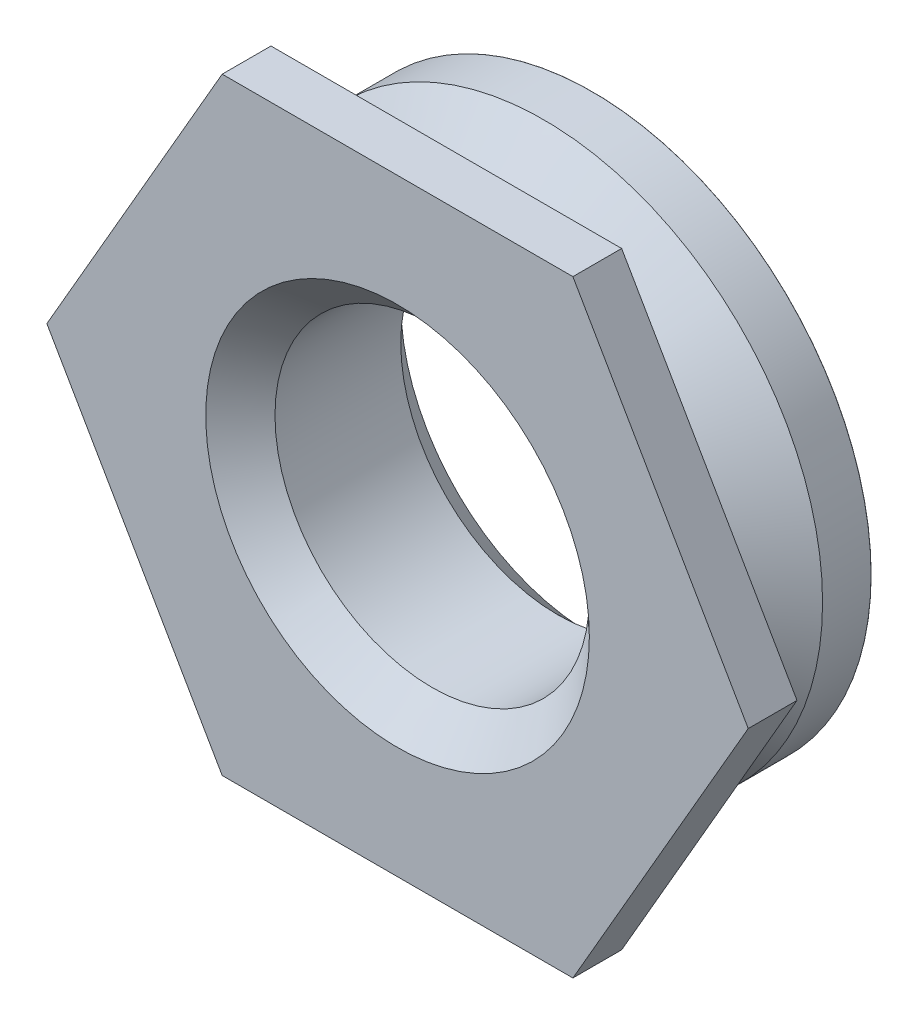
ISO-10303-21;
HEADER;
FILE_DESCRIPTION(('STEP AP214'),'2;1');
FILE_NAME('part.step','',(''),(''),'','','');
FILE_SCHEMA(('AUTOMOTIVE_DESIGN { 1 0 10303 214 1 1 1 1 }'));
ENDSEC;
DATA;
#1=APPLICATION_CONTEXT('core data for automotive mechanical design processes');
#2=APPLICATION_PROTOCOL_DEFINITION('international standard','automotive_design',2000,#1);
#3=PRODUCT_CONTEXT('',#1,'mechanical');
#4=PRODUCT('Part','Part','',(#3));
#5=PRODUCT_RELATED_PRODUCT_CATEGORY('part','',(#4));
#6=PRODUCT_DEFINITION_FORMATION('','',#4);
#7=PRODUCT_DEFINITION_CONTEXT('part definition',#1,'design');
#8=PRODUCT_DEFINITION('design','',#6,#7);
#9=PRODUCT_DEFINITION_SHAPE('','',#8);
#10=(LENGTH_UNIT() NAMED_UNIT(*) SI_UNIT(.MILLI.,.METRE.));
#11=(NAMED_UNIT(*) PLANE_ANGLE_UNIT() SI_UNIT($,.RADIAN.));
#12=(NAMED_UNIT(*) SI_UNIT($,.STERADIAN.) SOLID_ANGLE_UNIT());
#13=UNCERTAINTY_MEASURE_WITH_UNIT(LENGTH_MEASURE(1.E-05),#10,'distance_accuracy_value','');
#14=(GEOMETRIC_REPRESENTATION_CONTEXT(3) GLOBAL_UNCERTAINTY_ASSIGNED_CONTEXT((#13)) GLOBAL_UNIT_ASSIGNED_CONTEXT((#10,
#11,#12)) REPRESENTATION_CONTEXT('',''));
#15=CARTESIAN_POINT('',(0.,0.,0.));
#16=DIRECTION('',(0.,0.,1.));
#17=DIRECTION('',(1.,0.,0.));
#18=AXIS2_PLACEMENT_3D('',#15,#16,#17);
#19=CARTESIAN_POINT('',(0.,0.,0.38375));
#20=DIRECTION('',(0.,0.,-1.));
#21=DIRECTION('',(-1.,0.,0.));
#22=AXIS2_PLACEMENT_3D('',#19,#20,#21);
#23=CYLINDRICAL_SURFACE('',#22,4.36);
#24=CARTESIAN_POINT('',(0.,0.,0.00499999999999923));
#25=DIRECTION('',(0.,0.,-1.));
#26=DIRECTION('',(-1.,0.,0.));
#27=AXIS2_PLACEMENT_3D('',#24,#25,#26);
#28=CIRCLE('',#27,4.36);
#29=CARTESIAN_POINT('',(-4.36,0.,0.00499999999999816));
#30=VERTEX_POINT('',#29);
#31=EDGE_CURVE('E137',#30,#30,#28,.T.);
#32=ORIENTED_EDGE('',*,*,#31,.F.);
#33=EDGE_LOOP('',(#32));
#34=FACE_BOUND('',#33,.T.);
#35=CARTESIAN_POINT('',(0.,0.,0.762500000007548));
#36=DIRECTION('',(0.,0.,-1.));
#37=DIRECTION('',(1.,0.,0.));
#38=AXIS2_PLACEMENT_3D('',#35,#36,#37);
#39=CIRCLE('',#38,4.35999999996284);
#40=CARTESIAN_POINT('',(4.35999999996284,0.,0.762500000007549));
#41=VERTEX_POINT('',#40);
#42=EDGE_CURVE('E90',#41,#41,#39,.F.);
#43=ORIENTED_EDGE('',*,*,#42,.F.);
#44=EDGE_LOOP('',(#43));
#45=FACE_BOUND('',#44,.T.);
#46=ADVANCED_FACE('F16',(#34,#45),#23,.T.);
#47=CARTESIAN_POINT('',(0.,0.,0.00499999999999923));
#48=DIRECTION('',(0.,0.,-1.));
#49=DIRECTION('',(-1.,0.,0.));
#50=AXIS2_PLACEMENT_3D('',#47,#48,#49);
#51=TOROIDAL_SURFACE('',#50,4.355,0.00499999999999923);
#52=CARTESIAN_POINT('',(0.,0.,0.));
#53=DIRECTION('',(0.,0.,1.));
#54=DIRECTION('',(-1.,0.,0.));
#55=AXIS2_PLACEMENT_3D('',#52,#53,#54);
#56=CIRCLE('',#55,4.355);
#57=CARTESIAN_POINT('',(4.355,0.,0.));
#58=VERTEX_POINT('',#57);
#59=CARTESIAN_POINT('',(-4.355,0.,0.));
#60=VERTEX_POINT('',#59);
#61=EDGE_CURVE('E84',#58,#60,#56,.F.);
#62=ORIENTED_EDGE('',*,*,#61,.F.);
#63=CARTESIAN_POINT('',(0.,0.,0.));
#64=DIRECTION('',(0.,0.,1.));
#65=DIRECTION('',(1.,0.,0.));
#66=AXIS2_PLACEMENT_3D('',#63,#64,#65);
#67=CIRCLE('',#66,4.355);
#68=EDGE_CURVE('E81',#60,#58,#67,.F.);
#69=ORIENTED_EDGE('',*,*,#68,.F.);
#70=EDGE_LOOP('',(#62,#69));
#71=FACE_BOUND('',#70,.T.);
#72=ORIENTED_EDGE('',*,*,#31,.T.);
#73=EDGE_LOOP('',(#72));
#74=FACE_BOUND('',#73,.T.);
#75=ADVANCED_FACE('F85',(#71,#74),#51,.T.);
#76=CARTESIAN_POINT('',(0.,0.,0.762499999950704));
#77=DIRECTION('',(0.,0.,-1.));
#78=DIRECTION('',(-1.,0.,0.));
#79=AXIS2_PLACEMENT_3D('',#76,#77,#78);
#80=CONICAL_SURFACE('',#79,4.36000000007652,0.852291173873955);
#81=CARTESIAN_POINT('',(0.,0.,1.525));
#82=DIRECTION('',(0.,0.,-1.));
#83=DIRECTION('',(-1.,0.,0.));
#84=AXIS2_PLACEMENT_3D('',#81,#82,#83);
#85=CIRCLE('',#84,3.488);
#86=CARTESIAN_POINT('',(-3.488,0.,1.525));
#87=VERTEX_POINT('',#86);
#88=EDGE_CURVE('E96',#87,#87,#85,.F.);
#89=ORIENTED_EDGE('',*,*,#88,.F.);
#90=EDGE_LOOP('',(#89));
#91=FACE_BOUND('',#90,.T.);
#92=ORIENTED_EDGE('',*,*,#42,.T.);
#93=EDGE_LOOP('',(#92));
#94=FACE_BOUND('',#93,.T.);
#95=ADVANCED_FACE('F116',(#91,#94),#80,.T.);
#96=CARTESIAN_POINT('',(2.1775,0.,0.));
#97=DIRECTION('',(0.,0.,-1.));
#98=DIRECTION('',(-1.,0.,0.));
#99=AXIS2_PLACEMENT_3D('',#96,#97,#98);
#100=PLANE('',#99);
#101=ORIENTED_EDGE('',*,*,#61,.T.);
#102=ORIENTED_EDGE('',*,*,#68,.T.);
#103=EDGE_LOOP('',(#101,#102));
#104=FACE_BOUND('',#103,.T.);
#105=CARTESIAN_POINT('',(0.,0.,0.));
#106=DIRECTION('',(0.,0.,-1.));
#107=DIRECTION('',(-1.,0.,0.));
#108=AXIS2_PLACEMENT_3D('',#105,#106,#107);
#109=CIRCLE('',#108,3.00000000004275);
#110=CARTESIAN_POINT('',(-3.00000000004275,0.,0.));
#111=VERTEX_POINT('',#110);
#112=EDGE_CURVE('E146',#111,#111,#109,.F.);
#113=ORIENTED_EDGE('',*,*,#112,.T.);
#114=EDGE_LOOP('',(#113));
#115=FACE_BOUND('',#114,.T.);
#116=ADVANCED_FACE('F93',(#104,#115),#100,.T.);
#117=CARTESIAN_POINT('',(0.,0.,1.90375));
#118=DIRECTION('',(0.,0.,-1.));
#119=DIRECTION('',(-1.,0.,0.));
#120=AXIS2_PLACEMENT_3D('',#117,#118,#119);
#121=CYLINDRICAL_SURFACE('',#120,3.488);
#122=ORIENTED_EDGE('',*,*,#88,.T.);
#123=EDGE_LOOP('',(#122));
#124=FACE_BOUND('',#123,.T.);
#125=CARTESIAN_POINT('',(0.,0.,2.2825));
#126=DIRECTION('',(0.,0.,-1.));
#127=DIRECTION('',(-1.,0.,0.));
#128=AXIS2_PLACEMENT_3D('',#125,#126,#127);
#129=CIRCLE('',#128,3.488);
#130=CARTESIAN_POINT('',(-3.488,0.,2.2825));
#131=VERTEX_POINT('',#130);
#132=EDGE_CURVE('E150',#131,#131,#129,.T.);
#133=ORIENTED_EDGE('',*,*,#132,.T.);
#134=EDGE_LOOP('',(#133));
#135=FACE_BOUND('',#134,.T.);
#136=ADVANCED_FACE('F115',(#124,#135),#121,.T.);
#137=CARTESIAN_POINT('',(0.,0.,5.68441536246203E-11));
#138=DIRECTION('',(0.,0.,-1.));
#139=DIRECTION('',(-1.,0.,0.));
#140=AXIS2_PLACEMENT_3D('',#137,#138,#139);
#141=CONICAL_SURFACE('',#140,2.9999999999859,0.785398163397448);
#142=ORIENTED_EDGE('',*,*,#112,.F.);
#143=EDGE_LOOP('',(#142));
#144=FACE_BOUND('',#143,.T.);
#145=CARTESIAN_POINT('',(0.,0.,0.541500000000001));
#146=DIRECTION('',(0.,0.,-1.));
#147=DIRECTION('',(-1.,0.,0.));
#148=AXIS2_PLACEMENT_3D('',#145,#146,#147);
#149=CIRCLE('',#148,2.4585);
#150=CARTESIAN_POINT('',(-2.4585,0.,0.541500000000001));
#151=VERTEX_POINT('',#150);
#152=EDGE_CURVE('E182',#151,#151,#149,.F.);
#153=ORIENTED_EDGE('',*,*,#152,.T.);
#154=EDGE_LOOP('',(#153));
#155=FACE_BOUND('',#154,.T.);
#156=ADVANCED_FACE('F169',(#144,#155),#141,.F.);
#157=CARTESIAN_POINT('',(0.,0.,2.2825));
#158=DIRECTION('',(0.,0.,-1.));
#159=DIRECTION('',(-1.,0.,0.));
#160=AXIS2_PLACEMENT_3D('',#157,#158,#159);
#161=TOROIDAL_SURFACE('',#160,3.493,0.00499999999999989);
#162=CARTESIAN_POINT('',(0.,0.,2.2875));
#163=DIRECTION('',(0.,0.,-1.));
#164=DIRECTION('',(-1.,0.,0.));
#165=AXIS2_PLACEMENT_3D('',#162,#163,#164);
#166=CIRCLE('',#165,3.493);
#167=CARTESIAN_POINT('',(3.493,0.,2.2875));
#168=VERTEX_POINT('',#167);
#169=CARTESIAN_POINT('',(-3.493,0.,2.2875));
#170=VERTEX_POINT('',#169);
#171=EDGE_CURVE('E178',#168,#170,#166,.F.);
#172=ORIENTED_EDGE('',*,*,#171,.F.);
#173=CARTESIAN_POINT('',(0.,0.,2.2875));
#174=DIRECTION('',(0.,0.,-1.));
#175=DIRECTION('',(1.,0.,0.));
#176=AXIS2_PLACEMENT_3D('',#173,#174,#175);
#177=CIRCLE('',#176,3.493);
#178=EDGE_CURVE('E153',#170,#168,#177,.F.);
#179=ORIENTED_EDGE('',*,*,#178,.F.);
#180=EDGE_LOOP('',(#172,#179));
#181=FACE_BOUND('',#180,.T.);
#182=ORIENTED_EDGE('',*,*,#132,.F.);
#183=EDGE_LOOP('',(#182));
#184=FACE_BOUND('',#183,.T.);
#185=ADVANCED_FACE('F158',(#181,#184),#161,.F.);
#186=CARTESIAN_POINT('',(0.,0.,1.525));
#187=DIRECTION('',(0.,0.,-1.));
#188=DIRECTION('',(-1.,0.,0.));
#189=AXIS2_PLACEMENT_3D('',#186,#187,#188);
#190=CYLINDRICAL_SURFACE('',#189,2.4585);
#191=ORIENTED_EDGE('',*,*,#152,.F.);
#192=EDGE_LOOP('',(#191));
#193=FACE_BOUND('',#192,.T.);
#194=CARTESIAN_POINT('',(0.,0.,2.50850000003311));
#195=DIRECTION('',(0.,0.,1.));
#196=DIRECTION('',(-1.,0.,0.));
#197=AXIS2_PLACEMENT_3D('',#194,#195,#196);
#198=CIRCLE('',#197,2.45850000004566);
#199=CARTESIAN_POINT('',(-2.45850000004566,0.,2.50850000003311));
#200=VERTEX_POINT('',#199);
#201=EDGE_CURVE('E176',#200,#200,#198,.T.);
#202=ORIENTED_EDGE('',*,*,#201,.T.);
#203=EDGE_LOOP('',(#202));
#204=FACE_BOUND('',#203,.T.);
#205=ADVANCED_FACE('F168',(#193,#204),#190,.F.);
#206=CARTESIAN_POINT('',(0.,0.,2.2875));
#207=DIRECTION('',(0.,0.,-1.));
#208=DIRECTION('',(-1.,0.,0.));
#209=AXIS2_PLACEMENT_3D('',#206,#207,#208);
#210=PLANE('',#209);
#211=ORIENTED_EDGE('',*,*,#178,.T.);
#212=ORIENTED_EDGE('',*,*,#171,.T.);
#213=EDGE_LOOP('',(#211,#212));
#214=FACE_BOUND('',#213,.T.);
#215=DIRECTION('',(0.5,-0.866025403784438,0.));
#216=VECTOR('',#215,1.);
#217=CARTESIAN_POINT('',(-5.48482755730145,0.,2.2875));
#218=LINE('',#217,#216);
#219=CARTESIAN_POINT('',(-5.48482755730145,0.,2.2875));
#220=VERTEX_POINT('',#219);
#221=CARTESIAN_POINT('',(-2.74241377865073,-4.75,2.2875));
#222=VERTEX_POINT('',#221);
#223=EDGE_CURVE('E282',#220,#222,#218,.T.);
#224=ORIENTED_EDGE('',*,*,#223,.F.);
#225=DIRECTION('',(-0.5,-0.866025403784439,0.));
#226=VECTOR('',#225,1.);
#227=CARTESIAN_POINT('',(-2.74241377865073,4.75,2.2875));
#228=LINE('',#227,#226);
#229=CARTESIAN_POINT('',(-2.74241377865073,4.75,2.2875));
#230=VERTEX_POINT('',#229);
#231=EDGE_CURVE('E283',#230,#220,#228,.T.);
#232=ORIENTED_EDGE('',*,*,#231,.F.);
#233=DIRECTION('',(-1.,0.,0.));
#234=VECTOR('',#233,1.);
#235=CARTESIAN_POINT('',(0.,4.75,2.2875));
#236=LINE('',#235,#234);
#237=CARTESIAN_POINT('',(2.74241377865072,4.75,2.2875));
#238=VERTEX_POINT('',#237);
#239=EDGE_CURVE('E263',#238,#230,#236,.T.);
#240=ORIENTED_EDGE('',*,*,#239,.F.);
#241=DIRECTION('',(-0.5,0.866025403784439,0.));
#242=VECTOR('',#241,1.);
#243=CARTESIAN_POINT('',(5.48482755730144,0.,2.2875));
#244=LINE('',#243,#242);
#245=CARTESIAN_POINT('',(5.48482755730144,0.,2.2875));
#246=VERTEX_POINT('',#245);
#247=EDGE_CURVE('E271',#246,#238,#244,.T.);
#248=ORIENTED_EDGE('',*,*,#247,.F.);
#249=DIRECTION('',(0.5,0.866025403784439,0.));
#250=VECTOR('',#249,1.);
#251=CARTESIAN_POINT('',(2.74241377865072,-4.75,2.2875));
#252=LINE('',#251,#250);
#253=CARTESIAN_POINT('',(2.74241377865072,-4.75,2.2875));
#254=VERTEX_POINT('',#253);
#255=EDGE_CURVE('E322',#254,#246,#252,.T.);
#256=ORIENTED_EDGE('',*,*,#255,.F.);
#257=DIRECTION('',(1.,0.,0.));
#258=VECTOR('',#257,1.);
#259=CARTESIAN_POINT('',(-2.74241377865072,-4.75,2.2875));
#260=LINE('',#259,#258);
#261=EDGE_CURVE('E269',#222,#254,#260,.T.);
#262=ORIENTED_EDGE('',*,*,#261,.F.);
#263=EDGE_LOOP('',(#224,#232,#240,#248,#256,#262));
#264=FACE_BOUND('',#263,.T.);
#265=ADVANCED_FACE('F239',(#214,#264),#210,.T.);
#266=CARTESIAN_POINT('',(0.,0.,3.0500000000302));
#267=DIRECTION('',(0.,0.,1.));
#268=DIRECTION('',(1.,0.,0.));
#269=AXIS2_PLACEMENT_3D('',#266,#267,#268);
#270=CONICAL_SURFACE('',#269,3.00000000004275,0.785398163397448);
#271=CARTESIAN_POINT('',(0.,0.,3.04999999991651));
#272=DIRECTION('',(0.,0.,1.));
#273=DIRECTION('',(1.,0.,0.));
#274=AXIS2_PLACEMENT_3D('',#271,#272,#273);
#275=CIRCLE('',#274,2.99999999992906);
#276=CARTESIAN_POINT('',(2.99999999992906,0.,3.04999999991651));
#277=VERTEX_POINT('',#276);
#278=EDGE_CURVE('E141',#277,#277,#275,.F.);
#279=ORIENTED_EDGE('',*,*,#278,.F.);
#280=EDGE_LOOP('',(#279));
#281=FACE_BOUND('',#280,.T.);
#282=ORIENTED_EDGE('',*,*,#201,.F.);
#283=EDGE_LOOP('',(#282));
#284=FACE_BOUND('',#283,.T.);
#285=ADVANCED_FACE('F236',(#281,#284),#270,.F.);
#286=CARTESIAN_POINT('',(0.,4.75,3.05));
#287=DIRECTION('',(0.,1.,0.));
#288=DIRECTION('',(-1.,0.,0.));
#289=AXIS2_PLACEMENT_3D('',#286,#287,#288);
#290=PLANE('',#289);
#291=DIRECTION('',(1.,0.,0.));
#292=VECTOR('',#291,1.);
#293=CARTESIAN_POINT('',(1.7465,4.75,3.05));
#294=LINE('',#293,#292);
#295=CARTESIAN_POINT('',(2.74241377865072,4.75,3.05));
#296=VERTEX_POINT('',#295);
#297=CARTESIAN_POINT('',(-2.74241377865073,4.75,3.05));
#298=VERTEX_POINT('',#297);
#299=EDGE_CURVE('E145',#296,#298,#294,.F.);
#300=ORIENTED_EDGE('',*,*,#299,.F.);
#301=DIRECTION('',(0.,0.,1.));
#302=VECTOR('',#301,1.);
#303=CARTESIAN_POINT('',(2.74241377865072,4.75,3.05));
#304=LINE('',#303,#302);
#305=EDGE_CURVE('E274',#238,#296,#304,.T.);
#306=ORIENTED_EDGE('',*,*,#305,.F.);
#307=ORIENTED_EDGE('',*,*,#239,.T.);
#308=DIRECTION('',(0.,0.,1.));
#309=VECTOR('',#308,1.);
#310=CARTESIAN_POINT('',(-2.74241377865073,4.75,3.05));
#311=LINE('',#310,#309);
#312=EDGE_CURVE('E279',#298,#230,#311,.F.);
#313=ORIENTED_EDGE('',*,*,#312,.F.);
#314=EDGE_LOOP('',(#300,#306,#307,#313));
#315=FACE_BOUND('',#314,.T.);
#316=ADVANCED_FACE('F232',(#315),#290,.T.);
#317=CARTESIAN_POINT('',(-2.74241377865073,4.75,3.05));
#318=DIRECTION('',(-0.866025403784439,0.5,0.));
#319=DIRECTION('',(-0.5,-0.866025403784439,0.));
#320=AXIS2_PLACEMENT_3D('',#317,#318,#319);
#321=PLANE('',#320);
#322=DIRECTION('',(-0.5,-0.866025403784439,0.));
#323=VECTOR('',#322,1.);
#324=CARTESIAN_POINT('',(-2.74241377865073,4.75,3.05));
#325=LINE('',#324,#323);
#326=CARTESIAN_POINT('',(-5.48482755730145,0.,3.05));
#327=VERTEX_POINT('',#326);
#328=EDGE_CURVE('E291',#298,#327,#325,.T.);
#329=ORIENTED_EDGE('',*,*,#328,.F.);
#330=ORIENTED_EDGE('',*,*,#312,.T.);
#331=ORIENTED_EDGE('',*,*,#231,.T.);
#332=DIRECTION('',(0.,0.,1.));
#333=VECTOR('',#332,1.);
#334=CARTESIAN_POINT('',(-5.48482755730145,0.,3.05));
#335=LINE('',#334,#333);
#336=EDGE_CURVE('E294',#327,#220,#335,.F.);
#337=ORIENTED_EDGE('',*,*,#336,.F.);
#338=EDGE_LOOP('',(#329,#330,#331,#337));
#339=FACE_BOUND('',#338,.T.);
#340=ADVANCED_FACE('F228',(#339),#321,.T.);
#341=CARTESIAN_POINT('',(-5.48482755730145,0.,3.05));
#342=DIRECTION('',(-0.866025403784438,-0.5,0.));
#343=DIRECTION('',(0.5,-0.866025403784438,0.));
#344=AXIS2_PLACEMENT_3D('',#341,#342,#343);
#345=PLANE('',#344);
#346=DIRECTION('',(0.500000000000001,-0.866025403784438,0.));
#347=VECTOR('',#346,1.);
#348=CARTESIAN_POINT('',(-5.48482755730145,0.,3.05));
#349=LINE('',#348,#347);
#350=CARTESIAN_POINT('',(-2.74241377865072,-4.75,3.05));
#351=VERTEX_POINT('',#350);
#352=EDGE_CURVE('E308',#327,#351,#349,.T.);
#353=ORIENTED_EDGE('',*,*,#352,.F.);
#354=ORIENTED_EDGE('',*,*,#336,.T.);
#355=ORIENTED_EDGE('',*,*,#223,.T.);
#356=DIRECTION('',(0.,0.,1.));
#357=VECTOR('',#356,1.);
#358=CARTESIAN_POINT('',(-2.74241377865072,-4.75,3.05));
#359=LINE('',#358,#357);
#360=EDGE_CURVE('E310',#351,#222,#359,.F.);
#361=ORIENTED_EDGE('',*,*,#360,.F.);
#362=EDGE_LOOP('',(#353,#354,#355,#361));
#363=FACE_BOUND('',#362,.T.);
#364=ADVANCED_FACE('F224',(#363),#345,.T.);
#365=CARTESIAN_POINT('',(-2.74241377865072,-4.75,3.05));
#366=DIRECTION('',(0.,-1.,0.));
#367=DIRECTION('',(1.,0.,0.));
#368=AXIS2_PLACEMENT_3D('',#365,#366,#367);
#369=PLANE('',#368);
#370=DIRECTION('',(1.,0.,0.));
#371=VECTOR('',#370,1.);
#372=CARTESIAN_POINT('',(1.7465,-4.75,3.05));
#373=LINE('',#372,#371);
#374=CARTESIAN_POINT('',(2.74241377865072,-4.75,3.05));
#375=VERTEX_POINT('',#374);
#376=EDGE_CURVE('E314',#351,#375,#373,.T.);
#377=ORIENTED_EDGE('',*,*,#376,.F.);
#378=ORIENTED_EDGE('',*,*,#360,.T.);
#379=ORIENTED_EDGE('',*,*,#261,.T.);
#380=DIRECTION('',(0.,0.,1.));
#381=VECTOR('',#380,1.);
#382=CARTESIAN_POINT('',(2.74241377865072,-4.75,3.05));
#383=LINE('',#382,#381);
#384=EDGE_CURVE('E275',#375,#254,#383,.F.);
#385=ORIENTED_EDGE('',*,*,#384,.F.);
#386=EDGE_LOOP('',(#377,#378,#379,#385));
#387=FACE_BOUND('',#386,.T.);
#388=ADVANCED_FACE('F221',(#387),#369,.T.);
#389=CARTESIAN_POINT('',(2.74241377865072,-4.75,3.05));
#390=DIRECTION('',(0.866025403784439,-0.5,0.));
#391=DIRECTION('',(0.5,0.866025403784439,0.));
#392=AXIS2_PLACEMENT_3D('',#389,#390,#391);
#393=PLANE('',#392);
#394=DIRECTION('',(0.5,0.866025403784439,0.));
#395=VECTOR('',#394,1.);
#396=CARTESIAN_POINT('',(2.74241377865072,-4.75,3.05));
#397=LINE('',#396,#395);
#398=CARTESIAN_POINT('',(5.48482755730144,0.,3.05));
#399=VERTEX_POINT('',#398);
#400=EDGE_CURVE('E27',#375,#399,#397,.T.);
#401=ORIENTED_EDGE('',*,*,#400,.F.);
#402=ORIENTED_EDGE('',*,*,#384,.T.);
#403=ORIENTED_EDGE('',*,*,#255,.T.);
#404=DIRECTION('',(0.,0.,1.));
#405=VECTOR('',#404,1.);
#406=CARTESIAN_POINT('',(5.48482755730144,0.,3.05));
#407=LINE('',#406,#405);
#408=EDGE_CURVE('E36',#399,#246,#407,.F.);
#409=ORIENTED_EDGE('',*,*,#408,.F.);
#410=EDGE_LOOP('',(#401,#402,#403,#409));
#411=FACE_BOUND('',#410,.T.);
#412=ADVANCED_FACE('F213',(#411),#393,.T.);
#413=CARTESIAN_POINT('',(5.48482755730144,0.,3.05));
#414=DIRECTION('',(0.866025403784439,0.5,0.));
#415=DIRECTION('',(-0.5,0.866025403784439,0.));
#416=AXIS2_PLACEMENT_3D('',#413,#414,#415);
#417=PLANE('',#416);
#418=DIRECTION('',(-0.5,0.866025403784439,0.));
#419=VECTOR('',#418,1.);
#420=CARTESIAN_POINT('',(5.48482755730144,0.,3.05));
#421=LINE('',#420,#419);
#422=EDGE_CURVE('E11',#399,#296,#421,.T.);
#423=ORIENTED_EDGE('',*,*,#422,.F.);
#424=ORIENTED_EDGE('',*,*,#408,.T.);
#425=ORIENTED_EDGE('',*,*,#247,.T.);
#426=ORIENTED_EDGE('',*,*,#305,.T.);
#427=EDGE_LOOP('',(#423,#424,#425,#426));
#428=FACE_BOUND('',#427,.T.);
#429=ADVANCED_FACE('F208',(#428),#417,.T.);
#430=CARTESIAN_POINT('',(1.7465,0.,3.05));
#431=DIRECTION('',(0.,0.,1.));
#432=DIRECTION('',(1.,0.,0.));
#433=AXIS2_PLACEMENT_3D('',#430,#431,#432);
#434=PLANE('',#433);
#435=ORIENTED_EDGE('',*,*,#400,.T.);
#436=ORIENTED_EDGE('',*,*,#422,.T.);
#437=ORIENTED_EDGE('',*,*,#299,.T.);
#438=ORIENTED_EDGE('',*,*,#328,.T.);
#439=ORIENTED_EDGE('',*,*,#352,.T.);
#440=ORIENTED_EDGE('',*,*,#376,.T.);
#441=EDGE_LOOP('',(#435,#436,#437,#438,#439,#440));
#442=FACE_BOUND('',#441,.T.);
#443=ORIENTED_EDGE('',*,*,#278,.T.);
#444=EDGE_LOOP('',(#443));
#445=FACE_BOUND('',#444,.T.);
#446=ADVANCED_FACE('F206',(#442,#445),#434,.T.);
#447=CLOSED_SHELL('',(#46,#75,#95,#116,#136,#156,#185,#205,#265,#285,#316,#340,#364,#388,#412,
#429,#446));
#448=MANIFOLD_SOLID_BREP('B1',#447);
#449=ADVANCED_BREP_SHAPE_REPRESENTATION('',(#18,#448),#14);
#450=SHAPE_DEFINITION_REPRESENTATION(#9,#449);
ENDSEC;
END-ISO-10303-21;
